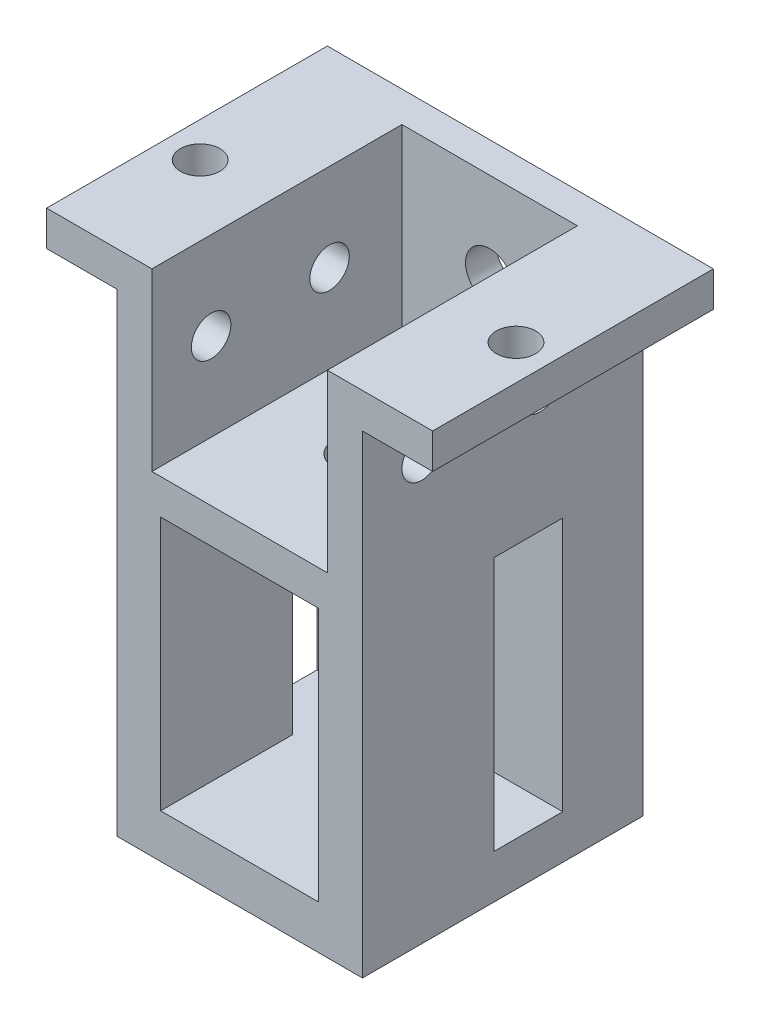
ISO-10303-21;
HEADER;
FILE_DESCRIPTION(('STEP AP214'),'2;1');
FILE_NAME('part.step','',(''),(''),'','','');
FILE_SCHEMA(('AUTOMOTIVE_DESIGN { 1 0 10303 214 1 1 1 1 }'));
ENDSEC;
DATA;
#1=APPLICATION_CONTEXT('core data for automotive mechanical design processes');
#2=APPLICATION_PROTOCOL_DEFINITION('international standard','automotive_design',2000,#1);
#3=PRODUCT_CONTEXT('',#1,'mechanical');
#4=PRODUCT('Part','Part','',(#3));
#5=PRODUCT_RELATED_PRODUCT_CATEGORY('part','',(#4));
#6=PRODUCT_DEFINITION_FORMATION('','',#4);
#7=PRODUCT_DEFINITION_CONTEXT('part definition',#1,'design');
#8=PRODUCT_DEFINITION('design','',#6,#7);
#9=PRODUCT_DEFINITION_SHAPE('','',#8);
#10=(LENGTH_UNIT() NAMED_UNIT(*) SI_UNIT(.MILLI.,.METRE.));
#11=(NAMED_UNIT(*) PLANE_ANGLE_UNIT() SI_UNIT($,.RADIAN.));
#12=(NAMED_UNIT(*) SI_UNIT($,.STERADIAN.) SOLID_ANGLE_UNIT());
#13=UNCERTAINTY_MEASURE_WITH_UNIT(LENGTH_MEASURE(1.E-05),#10,'distance_accuracy_value','');
#14=(GEOMETRIC_REPRESENTATION_CONTEXT(3) GLOBAL_UNCERTAINTY_ASSIGNED_CONTEXT((#13)) GLOBAL_UNIT_ASSIGNED_CONTEXT((#10,
#11,#12)) REPRESENTATION_CONTEXT('',''));
#15=CARTESIAN_POINT('',(0.,0.,0.));
#16=DIRECTION('',(0.,0.,1.));
#17=DIRECTION('',(1.,0.,0.));
#18=AXIS2_PLACEMENT_3D('',#15,#16,#17);
#19=CARTESIAN_POINT('',(-14.,0.,27.));
#20=DIRECTION('',(0.,1.,0.));
#21=DIRECTION('',(0.,0.,1.));
#22=AXIS2_PLACEMENT_3D('',#19,#20,#21);
#23=PLANE('',#22);
#24=CARTESIAN_POINT('',(0.,0.,13.5));
#25=DIRECTION('',(0.,1.,0.));
#26=DIRECTION('',(0.,0.,1.));
#27=AXIS2_PLACEMENT_3D('',#24,#25,#26);
#28=CIRCLE('',#27,2.75);
#29=CARTESIAN_POINT('',(0.,0.,10.75));
#30=VERTEX_POINT('',#29);
#31=EDGE_CURVE('E268',#30,#30,#28,.T.);
#32=ORIENTED_EDGE('',*,*,#31,.T.);
#33=EDGE_LOOP('',(#32));
#34=FACE_BOUND('',#33,.T.);
#35=DIRECTION('',(0.,0.,1.));
#36=VECTOR('',#35,1.);
#37=CARTESIAN_POINT('',(-9.,0.,27.));
#38=LINE('',#37,#36);
#39=CARTESIAN_POINT('',(-9.,0.,12.));
#40=VERTEX_POINT('',#39);
#41=CARTESIAN_POINT('',(-9.,0.,27.));
#42=VERTEX_POINT('',#41);
#43=EDGE_CURVE('E49',#40,#42,#38,.T.);
#44=ORIENTED_EDGE('',*,*,#43,.F.);
#45=DIRECTION('',(1.,0.,0.));
#46=VECTOR('',#45,1.);
#47=CARTESIAN_POINT('',(-14.,0.,12.));
#48=LINE('',#47,#46);
#49=CARTESIAN_POINT('',(-14.,0.,12.));
#50=VERTEX_POINT('',#49);
#51=EDGE_CURVE('E228',#50,#40,#48,.T.);
#52=ORIENTED_EDGE('',*,*,#51,.F.);
#53=DIRECTION('',(0.,0.,-1.));
#54=VECTOR('',#53,1.);
#55=CARTESIAN_POINT('',(-14.,0.,27.));
#56=LINE('',#55,#54);
#57=CARTESIAN_POINT('',(-14.,0.,4.17667107547479));
#58=VERTEX_POINT('',#57);
#59=EDGE_CURVE('E11',#50,#58,#56,.T.);
#60=ORIENTED_EDGE('',*,*,#59,.T.);
#61=DIRECTION('',(-1.,0.,0.));
#62=VECTOR('',#61,1.);
#63=CARTESIAN_POINT('',(-14.,0.,4.17667107547479));
#64=LINE('',#63,#62);
#65=CARTESIAN_POINT('',(14.,0.,4.17667107547479));
#66=VERTEX_POINT('',#65);
#67=EDGE_CURVE('E280',#66,#58,#64,.T.);
#68=ORIENTED_EDGE('',*,*,#67,.F.);
#69=DIRECTION('',(0.,0.,-1.));
#70=VECTOR('',#69,1.);
#71=CARTESIAN_POINT('',(14.,0.,27.));
#72=LINE('',#71,#70);
#73=CARTESIAN_POINT('',(14.,0.,12.));
#74=VERTEX_POINT('',#73);
#75=EDGE_CURVE('E41',#74,#66,#72,.T.);
#76=ORIENTED_EDGE('',*,*,#75,.F.);
#77=DIRECTION('',(1.,0.,0.));
#78=VECTOR('',#77,1.);
#79=CARTESIAN_POINT('',(14.,0.,12.));
#80=LINE('',#79,#78);
#81=CARTESIAN_POINT('',(9.,0.,12.));
#82=VERTEX_POINT('',#81);
#83=EDGE_CURVE('E245',#82,#74,#80,.T.);
#84=ORIENTED_EDGE('',*,*,#83,.F.);
#85=DIRECTION('',(0.,0.,-1.));
#86=VECTOR('',#85,1.);
#87=CARTESIAN_POINT('',(9.,0.,27.));
#88=LINE('',#87,#86);
#89=CARTESIAN_POINT('',(9.,0.,27.));
#90=VERTEX_POINT('',#89);
#91=EDGE_CURVE('E249',#90,#82,#88,.T.);
#92=ORIENTED_EDGE('',*,*,#91,.F.);
#93=DIRECTION('',(1.,0.,0.));
#94=VECTOR('',#93,1.);
#95=CARTESIAN_POINT('',(-14.,0.,27.));
#96=LINE('',#95,#94);
#97=EDGE_CURVE('E331',#42,#90,#96,.T.);
#98=ORIENTED_EDGE('',*,*,#97,.F.);
#99=EDGE_LOOP('',(#44,#52,#60,#68,#76,#84,#92,#98));
#100=FACE_BOUND('',#99,.T.);
#101=ADVANCED_FACE('F32',(#34,#100),#23,.F.);
#102=CARTESIAN_POINT('',(-14.,-29.,55.4429253066558));
#103=DIRECTION('',(0.,-1.,0.));
#104=DIRECTION('',(0.,0.,-1.));
#105=AXIS2_PLACEMENT_3D('',#102,#103,#104);
#106=PLANE('',#105);
#107=CARTESIAN_POINT('',(0.,-29.,13.5));
#108=DIRECTION('',(0.,-1.,0.));
#109=DIRECTION('',(0.,0.,-1.));
#110=AXIS2_PLACEMENT_3D('',#107,#108,#109);
#111=CIRCLE('',#110,2.75);
#112=CARTESIAN_POINT('',(0.,-29.,10.75));
#113=VERTEX_POINT('',#112);
#114=EDGE_CURVE('E264',#113,#113,#111,.T.);
#115=ORIENTED_EDGE('',*,*,#114,.T.);
#116=EDGE_LOOP('',(#115));
#117=FACE_BOUND('',#116,.T.);
#118=DIRECTION('',(0.,0.,1.));
#119=VECTOR('',#118,1.);
#120=CARTESIAN_POINT('',(-9.,-29.,27.));
#121=LINE('',#120,#119);
#122=CARTESIAN_POINT('',(-9.,-29.,12.));
#123=VERTEX_POINT('',#122);
#124=CARTESIAN_POINT('',(-9.,-29.,27.));
#125=VERTEX_POINT('',#124);
#126=EDGE_CURVE('E239',#123,#125,#121,.T.);
#127=ORIENTED_EDGE('',*,*,#126,.T.);
#128=DIRECTION('',(-1.,0.,0.));
#129=VECTOR('',#128,1.);
#130=CARTESIAN_POINT('',(-14.,-29.,27.));
#131=LINE('',#130,#129);
#132=CARTESIAN_POINT('',(9.,-29.,27.));
#133=VERTEX_POINT('',#132);
#134=EDGE_CURVE('E275',#133,#125,#131,.T.);
#135=ORIENTED_EDGE('',*,*,#134,.F.);
#136=DIRECTION('',(0.,0.,-1.));
#137=VECTOR('',#136,1.);
#138=CARTESIAN_POINT('',(9.,-29.,27.));
#139=LINE('',#138,#137);
#140=CARTESIAN_POINT('',(9.,-29.,12.));
#141=VERTEX_POINT('',#140);
#142=EDGE_CURVE('E255',#133,#141,#139,.T.);
#143=ORIENTED_EDGE('',*,*,#142,.T.);
#144=DIRECTION('',(1.,0.,0.));
#145=VECTOR('',#144,1.);
#146=CARTESIAN_POINT('',(14.,-29.,12.));
#147=LINE('',#146,#145);
#148=CARTESIAN_POINT('',(14.,-29.,12.));
#149=VERTEX_POINT('',#148);
#150=EDGE_CURVE('E242',#141,#149,#147,.T.);
#151=ORIENTED_EDGE('',*,*,#150,.T.);
#152=DIRECTION('',(0.,0.,-1.));
#153=VECTOR('',#152,1.);
#154=CARTESIAN_POINT('',(14.,-29.,55.4429253066558));
#155=LINE('',#154,#153);
#156=CARTESIAN_POINT('',(14.,-29.,4.17667107547479));
#157=VERTEX_POINT('',#156);
#158=EDGE_CURVE('E276',#149,#157,#155,.T.);
#159=ORIENTED_EDGE('',*,*,#158,.T.);
#160=DIRECTION('',(-1.,0.,0.));
#161=VECTOR('',#160,1.);
#162=CARTESIAN_POINT('',(-14.,-29.,4.17667107547479));
#163=LINE('',#162,#161);
#164=CARTESIAN_POINT('',(-14.,-29.,4.17667107547479));
#165=VERTEX_POINT('',#164);
#166=EDGE_CURVE('E272',#157,#165,#163,.T.);
#167=ORIENTED_EDGE('',*,*,#166,.T.);
#168=DIRECTION('',(0.,0.,-1.));
#169=VECTOR('',#168,1.);
#170=CARTESIAN_POINT('',(-14.,-29.,55.4429253066558));
#171=LINE('',#170,#169);
#172=CARTESIAN_POINT('',(-14.,-29.,12.));
#173=VERTEX_POINT('',#172);
#174=EDGE_CURVE('E271',#173,#165,#171,.T.);
#175=ORIENTED_EDGE('',*,*,#174,.F.);
#176=DIRECTION('',(1.,0.,0.));
#177=VECTOR('',#176,1.);
#178=CARTESIAN_POINT('',(-14.,-29.,12.));
#179=LINE('',#178,#177);
#180=EDGE_CURVE('E235',#173,#123,#179,.T.);
#181=ORIENTED_EDGE('',*,*,#180,.T.);
#182=EDGE_LOOP('',(#127,#135,#143,#151,#159,#167,#175,#181));
#183=FACE_BOUND('',#182,.T.);
#184=ADVANCED_FACE('F375',(#117,#183),#106,.F.);
#185=CARTESIAN_POINT('',(-14.,-34.,4.17667107547479));
#186=DIRECTION('',(0.,0.,-1.));
#187=DIRECTION('',(-1.,0.,0.));
#188=AXIS2_PLACEMENT_3D('',#185,#186,#187);
#189=PLANE('',#188);
#190=ORIENTED_EDGE('',*,*,#166,.F.);
#191=DIRECTION('',(0.,1.,0.));
#192=VECTOR('',#191,1.);
#193=CARTESIAN_POINT('',(14.,-34.,4.17667107547479));
#194=LINE('',#193,#192);
#195=EDGE_CURVE('E294',#157,#66,#194,.T.);
#196=ORIENTED_EDGE('',*,*,#195,.T.);
#197=ORIENTED_EDGE('',*,*,#67,.T.);
#198=DIRECTION('',(0.,1.,0.));
#199=VECTOR('',#198,1.);
#200=CARTESIAN_POINT('',(-14.,-34.,4.17667107547479));
#201=LINE('',#200,#199);
#202=EDGE_CURVE('E289',#165,#58,#201,.T.);
#203=ORIENTED_EDGE('',*,*,#202,.F.);
#204=EDGE_LOOP('',(#190,#196,#197,#203));
#205=FACE_BOUND('',#204,.T.);
#206=ADVANCED_FACE('F401',(#205),#189,.F.);
#207=CARTESIAN_POINT('',(-14.,20.,27.));
#208=DIRECTION('',(1.,0.,0.));
#209=DIRECTION('',(0.,1.,0.));
#210=AXIS2_PLACEMENT_3D('',#207,#208,#209);
#211=PLANE('',#210);
#212=DIRECTION('',(0.,1.,0.));
#213=VECTOR('',#212,1.);
#214=CARTESIAN_POINT('',(-14.,-34.002,12.));
#215=LINE('',#214,#213);
#216=EDGE_CURVE('E233',#173,#50,#215,.T.);
#217=ORIENTED_EDGE('',*,*,#216,.F.);
#218=ORIENTED_EDGE('',*,*,#174,.T.);
#219=ORIENTED_EDGE('',*,*,#202,.T.);
#220=ORIENTED_EDGE('',*,*,#59,.F.);
#221=EDGE_LOOP('',(#217,#218,#219,#220));
#222=FACE_BOUND('',#221,.T.);
#223=CARTESIAN_POINT('',(-14.,14.,6.75));
#224=DIRECTION('',(-1.,0.,0.));
#225=DIRECTION('',(0.,-1.,0.));
#226=AXIS2_PLACEMENT_3D('',#223,#224,#225);
#227=CIRCLE('',#226,2.25);
#228=CARTESIAN_POINT('',(-14.,11.75,6.75));
#229=VERTEX_POINT('',#228);
#230=EDGE_CURVE('E310',#229,#229,#227,.T.);
#231=ORIENTED_EDGE('',*,*,#230,.F.);
#232=EDGE_LOOP('',(#231));
#233=FACE_BOUND('',#232,.T.);
#234=CARTESIAN_POINT('',(-14.,14.,20.25));
#235=DIRECTION('',(-1.,0.,0.));
#236=DIRECTION('',(0.,-1.,0.));
#237=AXIS2_PLACEMENT_3D('',#234,#235,#236);
#238=CIRCLE('',#237,2.25);
#239=CARTESIAN_POINT('',(-14.,11.75,20.25));
#240=VERTEX_POINT('',#239);
#241=EDGE_CURVE('E301',#240,#240,#238,.T.);
#242=ORIENTED_EDGE('',*,*,#241,.F.);
#243=EDGE_LOOP('',(#242));
#244=FACE_BOUND('',#243,.T.);
#245=DIRECTION('',(0.,0.,-1.));
#246=VECTOR('',#245,1.);
#247=CARTESIAN_POINT('',(-14.,20.,27.));
#248=LINE('',#247,#246);
#249=CARTESIAN_POINT('',(-14.,20.,27.));
#250=VERTEX_POINT('',#249);
#251=CARTESIAN_POINT('',(-14.,20.,-5.));
#252=VERTEX_POINT('',#251);
#253=EDGE_CURVE('E352',#250,#252,#248,.T.);
#254=ORIENTED_EDGE('',*,*,#253,.T.);
#255=DIRECTION('',(0.,1.,0.));
#256=VECTOR('',#255,1.);
#257=CARTESIAN_POINT('',(-14.,-34.,-5.));
#258=LINE('',#257,#256);
#259=CARTESIAN_POINT('',(-14.,-34.,-5.));
#260=VERTEX_POINT('',#259);
#261=EDGE_CURVE('E210',#260,#252,#258,.T.);
#262=ORIENTED_EDGE('',*,*,#261,.F.);
#263=DIRECTION('',(0.,0.,-1.));
#264=VECTOR('',#263,1.);
#265=CARTESIAN_POINT('',(-14.,-34.,0.));
#266=LINE('',#265,#264);
#267=CARTESIAN_POINT('',(-14.,-34.,27.));
#268=VERTEX_POINT('',#267);
#269=EDGE_CURVE('E284',#268,#260,#266,.T.);
#270=ORIENTED_EDGE('',*,*,#269,.F.);
#271=DIRECTION('',(0.,-1.,0.));
#272=VECTOR('',#271,1.);
#273=CARTESIAN_POINT('',(-14.,20.,27.));
#274=LINE('',#273,#272);
#275=EDGE_CURVE('E329',#250,#268,#274,.T.);
#276=ORIENTED_EDGE('',*,*,#275,.F.);
#277=EDGE_LOOP('',(#254,#262,#270,#276));
#278=FACE_BOUND('',#277,.T.);
#279=ADVANCED_FACE('F34',(#222,#233,#244,#278),#211,.F.);
#280=CARTESIAN_POINT('',(14.,0.,27.));
#281=DIRECTION('',(-1.,0.,0.));
#282=DIRECTION('',(0.,-1.,0.));
#283=AXIS2_PLACEMENT_3D('',#280,#281,#282);
#284=PLANE('',#283);
#285=DIRECTION('',(0.,1.,0.));
#286=VECTOR('',#285,1.);
#287=CARTESIAN_POINT('',(14.,-34.002,12.));
#288=LINE('',#287,#286);
#289=EDGE_CURVE('E252',#149,#74,#288,.T.);
#290=ORIENTED_EDGE('',*,*,#289,.T.);
#291=ORIENTED_EDGE('',*,*,#75,.T.);
#292=ORIENTED_EDGE('',*,*,#195,.F.);
#293=ORIENTED_EDGE('',*,*,#158,.F.);
#294=EDGE_LOOP('',(#290,#291,#292,#293));
#295=FACE_BOUND('',#294,.T.);
#296=CARTESIAN_POINT('',(14.,14.,6.75));
#297=DIRECTION('',(-1.,0.,0.));
#298=DIRECTION('',(0.,-1.,0.));
#299=AXIS2_PLACEMENT_3D('',#296,#297,#298);
#300=CIRCLE('',#299,2.25);
#301=CARTESIAN_POINT('',(14.,11.75,6.75));
#302=VERTEX_POINT('',#301);
#303=EDGE_CURVE('E326',#302,#302,#300,.T.);
#304=ORIENTED_EDGE('',*,*,#303,.T.);
#305=EDGE_LOOP('',(#304));
#306=FACE_BOUND('',#305,.T.);
#307=CARTESIAN_POINT('',(14.,14.,20.25));
#308=DIRECTION('',(-1.,0.,0.));
#309=DIRECTION('',(0.,-1.,0.));
#310=AXIS2_PLACEMENT_3D('',#307,#308,#309);
#311=CIRCLE('',#310,2.25);
#312=CARTESIAN_POINT('',(14.,11.75,20.25));
#313=VERTEX_POINT('',#312);
#314=EDGE_CURVE('E319',#313,#313,#311,.T.);
#315=ORIENTED_EDGE('',*,*,#314,.T.);
#316=EDGE_LOOP('',(#315));
#317=FACE_BOUND('',#316,.T.);
#318=DIRECTION('',(0.,0.,1.));
#319=VECTOR('',#318,1.);
#320=CARTESIAN_POINT('',(14.,-34.,0.));
#321=LINE('',#320,#319);
#322=CARTESIAN_POINT('',(14.,-34.,-5.));
#323=VERTEX_POINT('',#322);
#324=CARTESIAN_POINT('',(14.,-34.,27.));
#325=VERTEX_POINT('',#324);
#326=EDGE_CURVE('E286',#323,#325,#321,.T.);
#327=ORIENTED_EDGE('',*,*,#326,.F.);
#328=DIRECTION('',(0.,-1.,0.));
#329=VECTOR('',#328,1.);
#330=CARTESIAN_POINT('',(14.,-34.,-5.));
#331=LINE('',#330,#329);
#332=CARTESIAN_POINT('',(14.,20.,-5.));
#333=VERTEX_POINT('',#332);
#334=EDGE_CURVE('E204',#333,#323,#331,.T.);
#335=ORIENTED_EDGE('',*,*,#334,.F.);
#336=DIRECTION('',(0.,0.,-1.));
#337=VECTOR('',#336,1.);
#338=CARTESIAN_POINT('',(14.,20.,27.));
#339=LINE('',#338,#337);
#340=CARTESIAN_POINT('',(14.,20.,27.));
#341=VERTEX_POINT('',#340);
#342=EDGE_CURVE('E366',#341,#333,#339,.T.);
#343=ORIENTED_EDGE('',*,*,#342,.F.);
#344=DIRECTION('',(0.,1.,0.));
#345=VECTOR('',#344,1.);
#346=CARTESIAN_POINT('',(14.,0.,27.));
#347=LINE('',#346,#345);
#348=EDGE_CURVE('E333',#325,#341,#347,.T.);
#349=ORIENTED_EDGE('',*,*,#348,.F.);
#350=EDGE_LOOP('',(#327,#335,#343,#349));
#351=FACE_BOUND('',#350,.T.);
#352=ADVANCED_FACE('F404',(#295,#306,#317,#351),#284,.F.);
#353=CARTESIAN_POINT('',(14.,20.,27.));
#354=DIRECTION('',(0.,1.,0.));
#355=DIRECTION('',(0.,0.,1.));
#356=AXIS2_PLACEMENT_3D('',#353,#354,#355);
#357=PLANE('',#356);
#358=CARTESIAN_POINT('',(18.,20.,13.5));
#359=DIRECTION('',(0.,-1.,0.));
#360=DIRECTION('',(0.,0.,-1.));
#361=AXIS2_PLACEMENT_3D('',#358,#359,#360);
#362=CIRCLE('',#361,2.25);
#363=CARTESIAN_POINT('',(18.,20.,11.25));
#364=VERTEX_POINT('',#363);
#365=EDGE_CURVE('E297',#364,#364,#362,.T.);
#366=ORIENTED_EDGE('',*,*,#365,.F.);
#367=EDGE_LOOP('',(#366));
#368=FACE_BOUND('',#367,.T.);
#369=ORIENTED_EDGE('',*,*,#342,.T.);
#370=DIRECTION('',(-1.,0.,0.));
#371=VECTOR('',#370,1.);
#372=CARTESIAN_POINT('',(14.,20.,-5.));
#373=LINE('',#372,#371);
#374=CARTESIAN_POINT('',(22.,20.,-5.));
#375=VERTEX_POINT('',#374);
#376=EDGE_CURVE('E225',#375,#333,#373,.T.);
#377=ORIENTED_EDGE('',*,*,#376,.F.);
#378=DIRECTION('',(0.,0.,-1.));
#379=VECTOR('',#378,1.);
#380=CARTESIAN_POINT('',(22.,20.,27.));
#381=LINE('',#380,#379);
#382=CARTESIAN_POINT('',(22.,20.,27.));
#383=VERTEX_POINT('',#382);
#384=EDGE_CURVE('E364',#383,#375,#381,.T.);
#385=ORIENTED_EDGE('',*,*,#384,.F.);
#386=DIRECTION('',(1.,0.,0.));
#387=VECTOR('',#386,1.);
#388=CARTESIAN_POINT('',(14.,20.,27.));
#389=LINE('',#388,#387);
#390=EDGE_CURVE('E335',#341,#383,#389,.T.);
#391=ORIENTED_EDGE('',*,*,#390,.F.);
#392=EDGE_LOOP('',(#369,#377,#385,#391));
#393=FACE_BOUND('',#392,.T.);
#394=ADVANCED_FACE('F407',(#368,#393),#357,.F.);
#395=CARTESIAN_POINT('',(22.,20.,27.));
#396=DIRECTION('',(-1.,0.,0.));
#397=DIRECTION('',(0.,0.,1.));
#398=AXIS2_PLACEMENT_3D('',#395,#396,#397);
#399=PLANE('',#398);
#400=ORIENTED_EDGE('',*,*,#384,.T.);
#401=DIRECTION('',(0.,-1.,0.));
#402=VECTOR('',#401,1.);
#403=CARTESIAN_POINT('',(22.,24.,-5.));
#404=LINE('',#403,#402);
#405=CARTESIAN_POINT('',(22.,24.,-5.));
#406=VERTEX_POINT('',#405);
#407=EDGE_CURVE('E222',#406,#375,#404,.T.);
#408=ORIENTED_EDGE('',*,*,#407,.F.);
#409=DIRECTION('',(0.,0.,-1.));
#410=VECTOR('',#409,1.);
#411=CARTESIAN_POINT('',(22.,24.,27.));
#412=LINE('',#411,#410);
#413=CARTESIAN_POINT('',(22.,24.,27.));
#414=VERTEX_POINT('',#413);
#415=EDGE_CURVE('E362',#414,#406,#412,.T.);
#416=ORIENTED_EDGE('',*,*,#415,.F.);
#417=DIRECTION('',(0.,1.,0.));
#418=VECTOR('',#417,1.);
#419=CARTESIAN_POINT('',(22.,20.,27.));
#420=LINE('',#419,#418);
#421=EDGE_CURVE('E337',#383,#414,#420,.T.);
#422=ORIENTED_EDGE('',*,*,#421,.F.);
#423=EDGE_LOOP('',(#400,#408,#416,#422));
#424=FACE_BOUND('',#423,.T.);
#425=ADVANCED_FACE('F411',(#424),#399,.F.);
#426=CARTESIAN_POINT('',(10.,24.,27.));
#427=DIRECTION('',(1.,0.,0.));
#428=DIRECTION('',(0.,1.,0.));
#429=AXIS2_PLACEMENT_3D('',#426,#427,#428);
#430=PLANE('',#429);
#431=CARTESIAN_POINT('',(10.,14.,6.75));
#432=DIRECTION('',(1.,0.,0.));
#433=DIRECTION('',(0.,1.,0.));
#434=AXIS2_PLACEMENT_3D('',#431,#432,#433);
#435=CIRCLE('',#434,2.25);
#436=CARTESIAN_POINT('',(10.,16.25,6.75));
#437=VERTEX_POINT('',#436);
#438=EDGE_CURVE('E323',#437,#437,#435,.T.);
#439=ORIENTED_EDGE('',*,*,#438,.T.);
#440=EDGE_LOOP('',(#439));
#441=FACE_BOUND('',#440,.T.);
#442=CARTESIAN_POINT('',(10.,14.,20.25));
#443=DIRECTION('',(1.,0.,0.));
#444=DIRECTION('',(0.,1.,0.));
#445=AXIS2_PLACEMENT_3D('',#442,#443,#444);
#446=CIRCLE('',#445,2.25);
#447=CARTESIAN_POINT('',(10.,16.25,20.25));
#448=VERTEX_POINT('',#447);
#449=EDGE_CURVE('E316',#448,#448,#446,.T.);
#450=ORIENTED_EDGE('',*,*,#449,.T.);
#451=EDGE_LOOP('',(#450));
#452=FACE_BOUND('',#451,.T.);
#453=DIRECTION('',(0.,0.,-1.));
#454=VECTOR('',#453,1.);
#455=CARTESIAN_POINT('',(10.,24.,27.));
#456=LINE('',#455,#454);
#457=CARTESIAN_POINT('',(10.,24.,27.));
#458=VERTEX_POINT('',#457);
#459=CARTESIAN_POINT('',(10.,24.,-1.5));
#460=VERTEX_POINT('',#459);
#461=EDGE_CURVE('E360',#458,#460,#456,.T.);
#462=ORIENTED_EDGE('',*,*,#461,.T.);
#463=DIRECTION('',(0.,1.,0.));
#464=VECTOR('',#463,1.);
#465=CARTESIAN_POINT('',(10.,4.,-1.5));
#466=LINE('',#465,#464);
#467=CARTESIAN_POINT('',(10.,4.,-1.5));
#468=VERTEX_POINT('',#467);
#469=EDGE_CURVE('E192',#468,#460,#466,.T.);
#470=ORIENTED_EDGE('',*,*,#469,.F.);
#471=DIRECTION('',(0.,0.,-1.));
#472=VECTOR('',#471,1.);
#473=CARTESIAN_POINT('',(10.,4.,27.));
#474=LINE('',#473,#472);
#475=CARTESIAN_POINT('',(10.,4.,27.));
#476=VERTEX_POINT('',#475);
#477=EDGE_CURVE('E182',#476,#468,#474,.T.);
#478=ORIENTED_EDGE('',*,*,#477,.F.);
#479=DIRECTION('',(0.,-1.,0.));
#480=VECTOR('',#479,1.);
#481=CARTESIAN_POINT('',(10.,24.,27.));
#482=LINE('',#481,#480);
#483=EDGE_CURVE('E341',#458,#476,#482,.T.);
#484=ORIENTED_EDGE('',*,*,#483,.F.);
#485=EDGE_LOOP('',(#462,#470,#478,#484));
#486=FACE_BOUND('',#485,.T.);
#487=ADVANCED_FACE('F415',(#441,#452,#486),#430,.F.);
#488=CARTESIAN_POINT('',(10.,4.,27.));
#489=DIRECTION('',(0.,-1.,0.));
#490=DIRECTION('',(1.,0.,0.));
#491=AXIS2_PLACEMENT_3D('',#488,#489,#490);
#492=PLANE('',#491);
#493=CARTESIAN_POINT('',(0.,4.,13.5));
#494=DIRECTION('',(0.,-1.,0.));
#495=DIRECTION('',(1.,0.,0.));
#496=AXIS2_PLACEMENT_3D('',#493,#494,#495);
#497=CIRCLE('',#496,2.75);
#498=CARTESIAN_POINT('',(0.,4.,10.75));
#499=VERTEX_POINT('',#498);
#500=EDGE_CURVE('E265',#499,#499,#497,.T.);
#501=ORIENTED_EDGE('',*,*,#500,.T.);
#502=EDGE_LOOP('',(#501));
#503=FACE_BOUND('',#502,.T.);
#504=ORIENTED_EDGE('',*,*,#477,.T.);
#505=DIRECTION('',(1.,0.,0.));
#506=VECTOR('',#505,1.);
#507=CARTESIAN_POINT('',(-10.,4.,-1.5));
#508=LINE('',#507,#506);
#509=CARTESIAN_POINT('',(-10.,4.,-1.5));
#510=VERTEX_POINT('',#509);
#511=EDGE_CURVE('E186',#510,#468,#508,.T.);
#512=ORIENTED_EDGE('',*,*,#511,.F.);
#513=DIRECTION('',(0.,0.,-1.));
#514=VECTOR('',#513,1.);
#515=CARTESIAN_POINT('',(-10.,4.,27.));
#516=LINE('',#515,#514);
#517=CARTESIAN_POINT('',(-10.,4.,27.));
#518=VERTEX_POINT('',#517);
#519=EDGE_CURVE('E172',#518,#510,#516,.T.);
#520=ORIENTED_EDGE('',*,*,#519,.F.);
#521=DIRECTION('',(-1.,0.,0.));
#522=VECTOR('',#521,1.);
#523=CARTESIAN_POINT('',(10.,4.,27.));
#524=LINE('',#523,#522);
#525=EDGE_CURVE('E343',#476,#518,#524,.T.);
#526=ORIENTED_EDGE('',*,*,#525,.F.);
#527=EDGE_LOOP('',(#504,#512,#520,#526));
#528=FACE_BOUND('',#527,.T.);
#529=ADVANCED_FACE('F187',(#503,#528),#492,.F.);
#530=CARTESIAN_POINT('',(-10.,4.,27.));
#531=DIRECTION('',(-1.,0.,0.));
#532=DIRECTION('',(0.,0.,1.));
#533=AXIS2_PLACEMENT_3D('',#530,#531,#532);
#534=PLANE('',#533);
#535=CARTESIAN_POINT('',(-10.,14.,6.75));
#536=DIRECTION('',(-1.,0.,0.));
#537=DIRECTION('',(0.,0.,1.));
#538=AXIS2_PLACEMENT_3D('',#535,#536,#537);
#539=CIRCLE('',#538,2.25);
#540=CARTESIAN_POINT('',(-10.,14.,9.));
#541=VERTEX_POINT('',#540);
#542=EDGE_CURVE('E322',#541,#541,#539,.T.);
#543=ORIENTED_EDGE('',*,*,#542,.T.);
#544=EDGE_LOOP('',(#543));
#545=FACE_BOUND('',#544,.T.);
#546=CARTESIAN_POINT('',(-10.,14.,20.25));
#547=DIRECTION('',(-1.,0.,0.));
#548=DIRECTION('',(0.,0.,1.));
#549=AXIS2_PLACEMENT_3D('',#546,#547,#548);
#550=CIRCLE('',#549,2.25);
#551=CARTESIAN_POINT('',(-10.,14.,22.5));
#552=VERTEX_POINT('',#551);
#553=EDGE_CURVE('E313',#552,#552,#550,.T.);
#554=ORIENTED_EDGE('',*,*,#553,.T.);
#555=EDGE_LOOP('',(#554));
#556=FACE_BOUND('',#555,.T.);
#557=ORIENTED_EDGE('',*,*,#519,.T.);
#558=DIRECTION('',(0.,-1.,0.));
#559=VECTOR('',#558,1.);
#560=CARTESIAN_POINT('',(-10.,4.,-1.5));
#561=LINE('',#560,#559);
#562=CARTESIAN_POINT('',(-10.,24.,-1.5));
#563=VERTEX_POINT('',#562);
#564=EDGE_CURVE('E177',#563,#510,#561,.T.);
#565=ORIENTED_EDGE('',*,*,#564,.F.);
#566=DIRECTION('',(0.,0.,-1.));
#567=VECTOR('',#566,1.);
#568=CARTESIAN_POINT('',(-10.,24.,27.));
#569=LINE('',#568,#567);
#570=CARTESIAN_POINT('',(-10.,24.,27.));
#571=VERTEX_POINT('',#570);
#572=EDGE_CURVE('E183',#571,#563,#569,.T.);
#573=ORIENTED_EDGE('',*,*,#572,.F.);
#574=DIRECTION('',(0.,1.,0.));
#575=VECTOR('',#574,1.);
#576=CARTESIAN_POINT('',(-10.,4.,27.));
#577=LINE('',#576,#575);
#578=EDGE_CURVE('E179',#518,#571,#577,.T.);
#579=ORIENTED_EDGE('',*,*,#578,.F.);
#580=EDGE_LOOP('',(#557,#565,#573,#579));
#581=FACE_BOUND('',#580,.T.);
#582=ADVANCED_FACE('F174',(#545,#556,#581),#534,.F.);
#583=CARTESIAN_POINT('',(-10.,24.,27.));
#584=DIRECTION('',(0.,-1.,0.));
#585=DIRECTION('',(0.,0.,-1.));
#586=AXIS2_PLACEMENT_3D('',#583,#584,#585);
#587=PLANE('',#586);
#588=ORIENTED_EDGE('',*,*,#572,.T.);
#589=DIRECTION('',(-1.,0.,0.));
#590=VECTOR('',#589,1.);
#591=CARTESIAN_POINT('',(-10.,24.,-1.5));
#592=LINE('',#591,#590);
#593=EDGE_CURVE('E196',#460,#563,#592,.T.);
#594=ORIENTED_EDGE('',*,*,#593,.F.);
#595=ORIENTED_EDGE('',*,*,#461,.F.);
#596=DIRECTION('',(-1.,0.,0.));
#597=VECTOR('',#596,1.);
#598=CARTESIAN_POINT('',(22.,24.,27.));
#599=LINE('',#598,#597);
#600=EDGE_CURVE('E339',#414,#458,#599,.T.);
#601=ORIENTED_EDGE('',*,*,#600,.F.);
#602=ORIENTED_EDGE('',*,*,#415,.T.);
#603=DIRECTION('',(1.,0.,0.));
#604=VECTOR('',#603,1.);
#605=CARTESIAN_POINT('',(-22.,24.,-5.));
#606=LINE('',#605,#604);
#607=CARTESIAN_POINT('',(-22.,24.,-5.));
#608=VERTEX_POINT('',#607);
#609=EDGE_CURVE('E219',#608,#406,#606,.T.);
#610=ORIENTED_EDGE('',*,*,#609,.F.);
#611=DIRECTION('',(0.,0.,-1.));
#612=VECTOR('',#611,1.);
#613=CARTESIAN_POINT('',(-22.,24.,27.));
#614=LINE('',#613,#612);
#615=CARTESIAN_POINT('',(-22.,24.,27.));
#616=VERTEX_POINT('',#615);
#617=EDGE_CURVE('E356',#616,#608,#614,.T.);
#618=ORIENTED_EDGE('',*,*,#617,.F.);
#619=DIRECTION('',(-1.,0.,0.));
#620=VECTOR('',#619,1.);
#621=CARTESIAN_POINT('',(-10.,24.,27.));
#622=LINE('',#621,#620);
#623=EDGE_CURVE('E346',#571,#616,#622,.T.);
#624=ORIENTED_EDGE('',*,*,#623,.F.);
#625=EDGE_LOOP('',(#588,#594,#595,#601,#602,#610,#618,#624));
#626=FACE_BOUND('',#625,.T.);
#627=CARTESIAN_POINT('',(-18.,24.,13.5));
#628=DIRECTION('',(0.,-1.,0.));
#629=DIRECTION('',(0.,0.,-1.));
#630=AXIS2_PLACEMENT_3D('',#627,#628,#629);
#631=CIRCLE('',#630,2.25);
#632=CARTESIAN_POINT('',(-18.,24.,11.25));
#633=VERTEX_POINT('',#632);
#634=EDGE_CURVE('E298',#633,#633,#631,.T.);
#635=ORIENTED_EDGE('',*,*,#634,.T.);
#636=EDGE_LOOP('',(#635));
#637=FACE_BOUND('',#636,.T.);
#638=CARTESIAN_POINT('',(18.,24.,13.5));
#639=DIRECTION('',(0.,-1.,0.));
#640=DIRECTION('',(0.,0.,-1.));
#641=AXIS2_PLACEMENT_3D('',#638,#639,#640);
#642=CIRCLE('',#641,2.25);
#643=CARTESIAN_POINT('',(18.,24.,11.25));
#644=VERTEX_POINT('',#643);
#645=EDGE_CURVE('E305',#644,#644,#642,.T.);
#646=ORIENTED_EDGE('',*,*,#645,.T.);
#647=EDGE_LOOP('',(#646));
#648=FACE_BOUND('',#647,.T.);
#649=ADVANCED_FACE('F425',(#626,#637,#648),#587,.F.);
#650=CARTESIAN_POINT('',(-22.,24.,27.));
#651=DIRECTION('',(1.,0.,0.));
#652=DIRECTION('',(0.,0.,-1.));
#653=AXIS2_PLACEMENT_3D('',#650,#651,#652);
#654=PLANE('',#653);
#655=ORIENTED_EDGE('',*,*,#617,.T.);
#656=DIRECTION('',(0.,1.,0.));
#657=VECTOR('',#656,1.);
#658=CARTESIAN_POINT('',(-22.,24.,-5.));
#659=LINE('',#658,#657);
#660=CARTESIAN_POINT('',(-22.,20.,-5.));
#661=VERTEX_POINT('',#660);
#662=EDGE_CURVE('E216',#661,#608,#659,.T.);
#663=ORIENTED_EDGE('',*,*,#662,.F.);
#664=DIRECTION('',(0.,0.,-1.));
#665=VECTOR('',#664,1.);
#666=CARTESIAN_POINT('',(-22.,20.,27.));
#667=LINE('',#666,#665);
#668=CARTESIAN_POINT('',(-22.,20.,27.));
#669=VERTEX_POINT('',#668);
#670=EDGE_CURVE('E354',#669,#661,#667,.T.);
#671=ORIENTED_EDGE('',*,*,#670,.F.);
#672=DIRECTION('',(0.,-1.,0.));
#673=VECTOR('',#672,1.);
#674=CARTESIAN_POINT('',(-22.,24.,27.));
#675=LINE('',#674,#673);
#676=EDGE_CURVE('E348',#616,#669,#675,.T.);
#677=ORIENTED_EDGE('',*,*,#676,.F.);
#678=EDGE_LOOP('',(#655,#663,#671,#677));
#679=FACE_BOUND('',#678,.T.);
#680=ADVANCED_FACE('F429',(#679),#654,.F.);
#681=CARTESIAN_POINT('',(-22.,20.,27.));
#682=DIRECTION('',(0.,1.,0.));
#683=DIRECTION('',(0.,0.,1.));
#684=AXIS2_PLACEMENT_3D('',#681,#682,#683);
#685=PLANE('',#684);
#686=CARTESIAN_POINT('',(-18.,20.,13.5));
#687=DIRECTION('',(0.,-1.,0.));
#688=DIRECTION('',(0.,0.,-1.));
#689=AXIS2_PLACEMENT_3D('',#686,#687,#688);
#690=CIRCLE('',#689,2.25);
#691=CARTESIAN_POINT('',(-18.,20.,11.25));
#692=VERTEX_POINT('',#691);
#693=EDGE_CURVE('E302',#692,#692,#690,.T.);
#694=ORIENTED_EDGE('',*,*,#693,.F.);
#695=EDGE_LOOP('',(#694));
#696=FACE_BOUND('',#695,.T.);
#697=ORIENTED_EDGE('',*,*,#670,.T.);
#698=DIRECTION('',(-1.,0.,0.));
#699=VECTOR('',#698,1.);
#700=CARTESIAN_POINT('',(-14.,20.,-5.));
#701=LINE('',#700,#699);
#702=EDGE_CURVE('E213',#252,#661,#701,.T.);
#703=ORIENTED_EDGE('',*,*,#702,.F.);
#704=ORIENTED_EDGE('',*,*,#253,.F.);
#705=DIRECTION('',(1.,0.,0.));
#706=VECTOR('',#705,1.);
#707=CARTESIAN_POINT('',(-22.,20.,27.));
#708=LINE('',#707,#706);
#709=EDGE_CURVE('E350',#669,#250,#708,.T.);
#710=ORIENTED_EDGE('',*,*,#709,.F.);
#711=EDGE_LOOP('',(#697,#703,#704,#710));
#712=FACE_BOUND('',#711,.T.);
#713=ADVANCED_FACE('F433',(#696,#712),#685,.F.);
#714=CARTESIAN_POINT('',(0.,0.,27.));
#715=DIRECTION('',(0.,0.,1.));
#716=DIRECTION('',(1.,0.,0.));
#717=AXIS2_PLACEMENT_3D('',#714,#715,#716);
#718=PLANE('',#717);
#719=ORIENTED_EDGE('',*,*,#275,.T.);
#720=DIRECTION('',(1.,0.,0.));
#721=VECTOR('',#720,1.);
#722=CARTESIAN_POINT('',(-14.,-34.,27.));
#723=LINE('',#722,#721);
#724=EDGE_CURVE('E277',#268,#325,#723,.T.);
#725=ORIENTED_EDGE('',*,*,#724,.T.);
#726=ORIENTED_EDGE('',*,*,#348,.T.);
#727=ORIENTED_EDGE('',*,*,#390,.T.);
#728=ORIENTED_EDGE('',*,*,#421,.T.);
#729=ORIENTED_EDGE('',*,*,#600,.T.);
#730=ORIENTED_EDGE('',*,*,#483,.T.);
#731=ORIENTED_EDGE('',*,*,#525,.T.);
#732=ORIENTED_EDGE('',*,*,#578,.T.);
#733=ORIENTED_EDGE('',*,*,#623,.T.);
#734=ORIENTED_EDGE('',*,*,#676,.T.);
#735=ORIENTED_EDGE('',*,*,#709,.T.);
#736=EDGE_LOOP('',(#719,#725,#726,#727,#728,#729,#730,#731,#732,#733,#734,#735));
#737=FACE_BOUND('',#736,.T.);
#738=ORIENTED_EDGE('',*,*,#134,.T.);
#739=DIRECTION('',(0.,1.,0.));
#740=VECTOR('',#739,1.);
#741=CARTESIAN_POINT('',(-9.,-34.002,27.));
#742=LINE('',#741,#740);
#743=EDGE_CURVE('E232',#125,#42,#742,.T.);
#744=ORIENTED_EDGE('',*,*,#743,.T.);
#745=ORIENTED_EDGE('',*,*,#97,.T.);
#746=DIRECTION('',(0.,1.,0.));
#747=VECTOR('',#746,1.);
#748=CARTESIAN_POINT('',(9.,-34.002,27.));
#749=LINE('',#748,#747);
#750=EDGE_CURVE('E57',#133,#90,#749,.T.);
#751=ORIENTED_EDGE('',*,*,#750,.F.);
#752=EDGE_LOOP('',(#738,#744,#745,#751));
#753=FACE_BOUND('',#752,.T.);
#754=ADVANCED_FACE('F437',(#737,#753),#718,.T.);
#755=CARTESIAN_POINT('',(22.,14.,20.25));
#756=DIRECTION('',(-1.,0.,0.));
#757=DIRECTION('',(0.,-1.,0.));
#758=AXIS2_PLACEMENT_3D('',#755,#756,#757);
#759=CYLINDRICAL_SURFACE('',#758,2.25);
#760=ORIENTED_EDGE('',*,*,#241,.T.);
#761=EDGE_LOOP('',(#760));
#762=FACE_BOUND('',#761,.T.);
#763=ORIENTED_EDGE('',*,*,#553,.F.);
#764=EDGE_LOOP('',(#763));
#765=FACE_BOUND('',#764,.T.);
#766=ADVANCED_FACE('F441',(#762,#765),#759,.F.);
#767=CARTESIAN_POINT('',(22.,14.,6.75));
#768=DIRECTION('',(-1.,0.,0.));
#769=DIRECTION('',(0.,-1.,0.));
#770=AXIS2_PLACEMENT_3D('',#767,#768,#769);
#771=CYLINDRICAL_SURFACE('',#770,2.25);
#772=ORIENTED_EDGE('',*,*,#230,.T.);
#773=EDGE_LOOP('',(#772));
#774=FACE_BOUND('',#773,.T.);
#775=ORIENTED_EDGE('',*,*,#542,.F.);
#776=EDGE_LOOP('',(#775));
#777=FACE_BOUND('',#776,.T.);
#778=ADVANCED_FACE('F447',(#774,#777),#771,.F.);
#779=ORIENTED_EDGE('',*,*,#449,.F.);
#780=EDGE_LOOP('',(#779));
#781=FACE_BOUND('',#780,.T.);
#782=ORIENTED_EDGE('',*,*,#314,.F.);
#783=EDGE_LOOP('',(#782));
#784=FACE_BOUND('',#783,.T.);
#785=ADVANCED_FACE('F443',(#781,#784),#759,.F.);
#786=ORIENTED_EDGE('',*,*,#438,.F.);
#787=EDGE_LOOP('',(#786));
#788=FACE_BOUND('',#787,.T.);
#789=ORIENTED_EDGE('',*,*,#303,.F.);
#790=EDGE_LOOP('',(#789));
#791=FACE_BOUND('',#790,.T.);
#792=ADVANCED_FACE('F446',(#788,#791),#771,.F.);
#793=CARTESIAN_POINT('',(-18.,24.,13.5));
#794=DIRECTION('',(0.,-1.,0.));
#795=DIRECTION('',(0.,0.,-1.));
#796=AXIS2_PLACEMENT_3D('',#793,#794,#795);
#797=CYLINDRICAL_SURFACE('',#796,2.25);
#798=ORIENTED_EDGE('',*,*,#634,.F.);
#799=EDGE_LOOP('',(#798));
#800=FACE_BOUND('',#799,.T.);
#801=ORIENTED_EDGE('',*,*,#693,.T.);
#802=EDGE_LOOP('',(#801));
#803=FACE_BOUND('',#802,.T.);
#804=ADVANCED_FACE('F451',(#800,#803),#797,.F.);
#805=CARTESIAN_POINT('',(18.,24.,13.5));
#806=DIRECTION('',(0.,-1.,0.));
#807=DIRECTION('',(0.,0.,-1.));
#808=AXIS2_PLACEMENT_3D('',#805,#806,#807);
#809=CYLINDRICAL_SURFACE('',#808,2.25);
#810=ORIENTED_EDGE('',*,*,#645,.F.);
#811=EDGE_LOOP('',(#810));
#812=FACE_BOUND('',#811,.T.);
#813=ORIENTED_EDGE('',*,*,#365,.T.);
#814=EDGE_LOOP('',(#813));
#815=FACE_BOUND('',#814,.T.);
#816=ADVANCED_FACE('F391',(#812,#815),#809,.F.);
#817=CARTESIAN_POINT('',(0.,-34.,0.));
#818=DIRECTION('',(0.,1.,0.));
#819=DIRECTION('',(0.,0.,1.));
#820=AXIS2_PLACEMENT_3D('',#817,#818,#819);
#821=PLANE('',#820);
#822=CARTESIAN_POINT('',(0.,-34.,13.5));
#823=DIRECTION('',(0.,-1.,0.));
#824=DIRECTION('',(0.,0.,-1.));
#825=AXIS2_PLACEMENT_3D('',#822,#823,#824);
#826=CIRCLE('',#825,2.75);
#827=CARTESIAN_POINT('',(0.,-34.,10.75));
#828=VERTEX_POINT('',#827);
#829=EDGE_CURVE('E248',#828,#828,#826,.T.);
#830=ORIENTED_EDGE('',*,*,#829,.F.);
#831=EDGE_LOOP('',(#830));
#832=FACE_BOUND('',#831,.T.);
#833=ORIENTED_EDGE('',*,*,#269,.T.);
#834=DIRECTION('',(-1.,0.,0.));
#835=VECTOR('',#834,1.);
#836=CARTESIAN_POINT('',(14.,-34.,-5.));
#837=LINE('',#836,#835);
#838=EDGE_CURVE('E207',#323,#260,#837,.T.);
#839=ORIENTED_EDGE('',*,*,#838,.F.);
#840=ORIENTED_EDGE('',*,*,#326,.T.);
#841=ORIENTED_EDGE('',*,*,#724,.F.);
#842=EDGE_LOOP('',(#833,#839,#840,#841));
#843=FACE_BOUND('',#842,.T.);
#844=ADVANCED_FACE('F381',(#832,#843),#821,.F.);
#845=CARTESIAN_POINT('',(0.,24.,13.5));
#846=DIRECTION('',(0.,-1.,0.));
#847=DIRECTION('',(0.,0.,-1.));
#848=AXIS2_PLACEMENT_3D('',#845,#846,#847);
#849=CYLINDRICAL_SURFACE('',#848,2.75);
#850=CARTESIAN_POINT('',(0.,-34.,10.75));
#851=CARTESIAN_POINT('',(0.,-33.9479166666667,10.75));
#852=CARTESIAN_POINT('',(0.,-33.8958333333333,10.75));
#853=CARTESIAN_POINT('',(0.,-33.7916666666667,10.75));
#854=CARTESIAN_POINT('',(0.,-33.7395833333333,10.75));
#855=CARTESIAN_POINT('',(0.,-33.6354166666667,10.75));
#856=CARTESIAN_POINT('',(0.,-33.5833333333333,10.75));
#857=CARTESIAN_POINT('',(0.,-33.4791666666667,10.75));
#858=CARTESIAN_POINT('',(0.,-33.4270833333333,10.75));
#859=CARTESIAN_POINT('',(0.,-33.3229166666667,10.75));
#860=CARTESIAN_POINT('',(0.,-33.2708333333333,10.75));
#861=CARTESIAN_POINT('',(0.,-33.1666666666667,10.75));
#862=CARTESIAN_POINT('',(0.,-33.1145833333333,10.75));
#863=CARTESIAN_POINT('',(0.,-33.0104166666667,10.75));
#864=CARTESIAN_POINT('',(0.,-32.9583333333333,10.75));
#865=CARTESIAN_POINT('',(0.,-32.8541666666667,10.75));
#866=CARTESIAN_POINT('',(0.,-32.8020833333333,10.75));
#867=CARTESIAN_POINT('',(0.,-32.6979166666667,10.75));
#868=CARTESIAN_POINT('',(0.,-32.6458333333333,10.75));
#869=CARTESIAN_POINT('',(0.,-32.5416666666667,10.75));
#870=CARTESIAN_POINT('',(0.,-32.4895833333333,10.75));
#871=CARTESIAN_POINT('',(0.,-32.3854166666667,10.75));
#872=CARTESIAN_POINT('',(0.,-32.3333333333333,10.75));
#873=CARTESIAN_POINT('',(0.,-32.2291666666667,10.75));
#874=CARTESIAN_POINT('',(0.,-32.1770833333333,10.75));
#875=CARTESIAN_POINT('',(0.,-32.0729166666667,10.75));
#876=CARTESIAN_POINT('',(0.,-32.0208333333333,10.75));
#877=CARTESIAN_POINT('',(0.,-31.9166666666667,10.75));
#878=CARTESIAN_POINT('',(0.,-31.8645833333333,10.75));
#879=CARTESIAN_POINT('',(0.,-31.7604166666667,10.75));
#880=CARTESIAN_POINT('',(0.,-31.7083333333333,10.75));
#881=CARTESIAN_POINT('',(0.,-31.6041666666667,10.75));
#882=CARTESIAN_POINT('',(0.,-31.5520833333333,10.75));
#883=CARTESIAN_POINT('',(0.,-31.4479166666667,10.75));
#884=CARTESIAN_POINT('',(0.,-31.3958333333333,10.75));
#885=CARTESIAN_POINT('',(0.,-31.2916666666667,10.75));
#886=CARTESIAN_POINT('',(0.,-31.2395833333333,10.75));
#887=CARTESIAN_POINT('',(0.,-31.1354166666667,10.75));
#888=CARTESIAN_POINT('',(0.,-31.0833333333333,10.75));
#889=CARTESIAN_POINT('',(0.,-30.9791666666667,10.75));
#890=CARTESIAN_POINT('',(0.,-30.9270833333333,10.75));
#891=CARTESIAN_POINT('',(0.,-30.8229166666667,10.75));
#892=CARTESIAN_POINT('',(0.,-30.7708333333333,10.75));
#893=CARTESIAN_POINT('',(0.,-30.6666666666667,10.75));
#894=CARTESIAN_POINT('',(0.,-30.6145833333333,10.75));
#895=CARTESIAN_POINT('',(0.,-30.5104166666667,10.75));
#896=CARTESIAN_POINT('',(0.,-30.4583333333333,10.75));
#897=CARTESIAN_POINT('',(0.,-30.3541666666667,10.75));
#898=CARTESIAN_POINT('',(0.,-30.3020833333333,10.75));
#899=CARTESIAN_POINT('',(0.,-30.1979166666667,10.75));
#900=CARTESIAN_POINT('',(0.,-30.1458333333333,10.75));
#901=CARTESIAN_POINT('',(0.,-30.0416666666667,10.75));
#902=CARTESIAN_POINT('',(0.,-29.9895833333333,10.75));
#903=CARTESIAN_POINT('',(0.,-29.8854166666667,10.75));
#904=CARTESIAN_POINT('',(0.,-29.8333333333333,10.75));
#905=CARTESIAN_POINT('',(0.,-29.7291666666667,10.75));
#906=CARTESIAN_POINT('',(0.,-29.6770833333333,10.75));
#907=CARTESIAN_POINT('',(0.,-29.5729166666667,10.75));
#908=CARTESIAN_POINT('',(0.,-29.5208333333333,10.75));
#909=CARTESIAN_POINT('',(0.,-29.4166666666667,10.75));
#910=CARTESIAN_POINT('',(0.,-29.3645833333333,10.75));
#911=CARTESIAN_POINT('',(0.,-29.2604166666667,10.75));
#912=CARTESIAN_POINT('',(0.,-29.2083333333333,10.75));
#913=CARTESIAN_POINT('',(0.,-29.1041666666667,10.75));
#914=CARTESIAN_POINT('',(0.,-29.0520833333333,10.75));
#915=CARTESIAN_POINT('',(0.,-29.,10.75));
#916=B_SPLINE_CURVE_WITH_KNOTS('',3,(#850,#851,#852,#853,#854,#855,#856,#857,#858,#859,#860,
#861,#862,#863,#864,#865,#866,#867,#868,#869,#870,#871,#872,#873,#874,#875,#876,#877,#878,#879,
#880,#881,#882,#883,#884,#885,#886,#887,#888,#889,#890,#891,#892,#893,#894,#895,#896,#897,#898,
#899,#900,#901,#902,#903,#904,#905,#906,#907,#908,#909,#910,#911,#912,#913,#914,#915),
.UNSPECIFIED.,.F.,.F.,(4,2,2,2,2,2,2,2,2,2,2,2,2,2,2,2,2,2,2,2,2,2,2,2,2,2,2,2,2,2,2,2,4),(0.,
0.156249999999997,0.3125,0.468750000000004,0.625000000000001,0.781249999999997,
0.937500000000001,1.09375,1.25,1.40625,1.5625,1.71875,1.875,2.03125,2.1875,2.34375000000001,2.5,
2.65625,2.8125,2.96875000000001,3.125,3.28125,3.4375,3.59375000000001,3.75,3.90625,4.0625,
4.21875000000001,4.375,4.53125,4.6875,4.84375000000001,5.),.UNSPECIFIED.);
#917=EDGE_CURVE('BSEAM378',#828,#113,#916,.T.);
#918=ORIENTED_EDGE('',*,*,#829,.T.);
#919=ORIENTED_EDGE('',*,*,#114,.F.);
#920=ORIENTED_EDGE('',*,*,#917,.T.);
#921=ORIENTED_EDGE('',*,*,#917,.F.);
#922=EDGE_LOOP('',(#918,#920,#919,#921));
#923=FACE_BOUND('',#922,.T.);
#924=ADVANCED_FACE('F378',(#923),#849,.F.);
#925=CARTESIAN_POINT('',(0.,4.,10.75));
#926=CARTESIAN_POINT('',(0.,3.95833333333333,10.75));
#927=CARTESIAN_POINT('',(0.,3.91666666666667,10.75));
#928=CARTESIAN_POINT('',(0.,3.83333333333333,10.75));
#929=CARTESIAN_POINT('',(0.,3.79166666666667,10.75));
#930=CARTESIAN_POINT('',(0.,3.70833333333333,10.75));
#931=CARTESIAN_POINT('',(0.,3.66666666666667,10.75));
#932=CARTESIAN_POINT('',(0.,3.58333333333333,10.75));
#933=CARTESIAN_POINT('',(0.,3.54166666666667,10.75));
#934=CARTESIAN_POINT('',(0.,3.45833333333333,10.75));
#935=CARTESIAN_POINT('',(0.,3.41666666666667,10.75));
#936=CARTESIAN_POINT('',(0.,3.33333333333333,10.75));
#937=CARTESIAN_POINT('',(0.,3.29166666666667,10.75));
#938=CARTESIAN_POINT('',(0.,3.20833333333333,10.75));
#939=CARTESIAN_POINT('',(0.,3.16666666666667,10.75));
#940=CARTESIAN_POINT('',(0.,3.08333333333333,10.75));
#941=CARTESIAN_POINT('',(0.,3.04166666666667,10.75));
#942=CARTESIAN_POINT('',(0.,2.95833333333333,10.75));
#943=CARTESIAN_POINT('',(0.,2.91666666666667,10.75));
#944=CARTESIAN_POINT('',(0.,2.83333333333333,10.75));
#945=CARTESIAN_POINT('',(0.,2.79166666666667,10.75));
#946=CARTESIAN_POINT('',(0.,2.70833333333333,10.75));
#947=CARTESIAN_POINT('',(0.,2.66666666666667,10.75));
#948=CARTESIAN_POINT('',(0.,2.58333333333333,10.75));
#949=CARTESIAN_POINT('',(0.,2.54166666666667,10.75));
#950=CARTESIAN_POINT('',(0.,2.45833333333333,10.75));
#951=CARTESIAN_POINT('',(0.,2.41666666666667,10.75));
#952=CARTESIAN_POINT('',(0.,2.33333333333333,10.75));
#953=CARTESIAN_POINT('',(0.,2.29166666666667,10.75));
#954=CARTESIAN_POINT('',(0.,2.20833333333333,10.75));
#955=CARTESIAN_POINT('',(0.,2.16666666666667,10.75));
#956=CARTESIAN_POINT('',(0.,2.08333333333333,10.75));
#957=CARTESIAN_POINT('',(0.,2.04166666666667,10.75));
#958=CARTESIAN_POINT('',(0.,1.95833333333333,10.75));
#959=CARTESIAN_POINT('',(0.,1.91666666666666,10.75));
#960=CARTESIAN_POINT('',(0.,1.83333333333333,10.75));
#961=CARTESIAN_POINT('',(0.,1.79166666666666,10.75));
#962=CARTESIAN_POINT('',(0.,1.70833333333333,10.75));
#963=CARTESIAN_POINT('',(0.,1.66666666666666,10.75));
#964=CARTESIAN_POINT('',(0.,1.58333333333333,10.75));
#965=CARTESIAN_POINT('',(0.,1.54166666666666,10.75));
#966=CARTESIAN_POINT('',(0.,1.45833333333333,10.75));
#967=CARTESIAN_POINT('',(0.,1.41666666666666,10.75));
#968=CARTESIAN_POINT('',(0.,1.33333333333333,10.75));
#969=CARTESIAN_POINT('',(0.,1.29166666666666,10.75));
#970=CARTESIAN_POINT('',(0.,1.20833333333333,10.75));
#971=CARTESIAN_POINT('',(0.,1.16666666666666,10.75));
#972=CARTESIAN_POINT('',(0.,1.08333333333333,10.75));
#973=CARTESIAN_POINT('',(0.,1.04166666666666,10.75));
#974=CARTESIAN_POINT('',(0.,0.958333333333331,10.75));
#975=CARTESIAN_POINT('',(0.,0.916666666666664,10.75));
#976=CARTESIAN_POINT('',(0.,0.833333333333331,10.75));
#977=CARTESIAN_POINT('',(0.,0.791666666666664,10.75));
#978=CARTESIAN_POINT('',(0.,0.70833333333333,10.75));
#979=CARTESIAN_POINT('',(0.,0.666666666666664,10.75));
#980=CARTESIAN_POINT('',(0.,0.58333333333333,10.75));
#981=CARTESIAN_POINT('',(0.,0.541666666666664,10.75));
#982=CARTESIAN_POINT('',(0.,0.45833333333333,10.75));
#983=CARTESIAN_POINT('',(0.,0.416666666666664,10.75));
#984=CARTESIAN_POINT('',(0.,0.33333333333333,10.75));
#985=CARTESIAN_POINT('',(0.,0.291666666666663,10.75));
#986=CARTESIAN_POINT('',(0.,0.20833333333333,10.75));
#987=CARTESIAN_POINT('',(0.,0.166666666666663,10.75));
#988=CARTESIAN_POINT('',(0.,0.0833333333333299,10.75));
#989=CARTESIAN_POINT('',(0.,0.0416666666666632,10.75));
#990=CARTESIAN_POINT('',(0.,0.,10.75));
#991=B_SPLINE_CURVE_WITH_KNOTS('',3,(#925,#926,#927,#928,#929,#930,#931,#932,#933,#934,#935,
#936,#937,#938,#939,#940,#941,#942,#943,#944,#945,#946,#947,#948,#949,#950,#951,#952,#953,#954,
#955,#956,#957,#958,#959,#960,#961,#962,#963,#964,#965,#966,#967,#968,#969,#970,#971,#972,#973,
#974,#975,#976,#977,#978,#979,#980,#981,#982,#983,#984,#985,#986,#987,#988,#989,#990),
.UNSPECIFIED.,.F.,.F.,(4,2,2,2,2,2,2,2,2,2,2,2,2,2,2,2,2,2,2,2,2,2,2,2,2,2,2,2,2,2,2,2,4),(0.,
0.125,0.25,0.375,0.5,0.625000000000001,0.750000000000001,0.875000000000001,1.,1.125,1.25,1.375,
1.5,1.625,1.75,1.875,2.,2.125,2.25,2.375,2.5,2.625,2.75,2.875,3.,3.125,3.25,3.375,3.5,3.625,
3.75,3.875,4.),.UNSPECIFIED.);
#992=EDGE_CURVE('BSEAM380',#499,#30,#991,.T.);
#993=ORIENTED_EDGE('',*,*,#500,.F.);
#994=ORIENTED_EDGE('',*,*,#31,.F.);
#995=ORIENTED_EDGE('',*,*,#992,.T.);
#996=ORIENTED_EDGE('',*,*,#992,.F.);
#997=EDGE_LOOP('',(#993,#995,#994,#996));
#998=FACE_BOUND('',#997,.T.);
#999=ADVANCED_FACE('F380',(#998),#849,.F.);
#1000=CARTESIAN_POINT('',(14.,-34.002,12.));
#1001=DIRECTION('',(0.,0.,1.));
#1002=DIRECTION('',(1.,0.,0.));
#1003=AXIS2_PLACEMENT_3D('',#1000,#1001,#1002);
#1004=PLANE('',#1003);
#1005=ORIENTED_EDGE('',*,*,#150,.F.);
#1006=DIRECTION('',(0.,1.,0.));
#1007=VECTOR('',#1006,1.);
#1008=CARTESIAN_POINT('',(9.,-34.002,12.));
#1009=LINE('',#1008,#1007);
#1010=EDGE_CURVE('E254',#141,#82,#1009,.T.);
#1011=ORIENTED_EDGE('',*,*,#1010,.T.);
#1012=ORIENTED_EDGE('',*,*,#83,.T.);
#1013=ORIENTED_EDGE('',*,*,#289,.F.);
#1014=EDGE_LOOP('',(#1005,#1011,#1012,#1013));
#1015=FACE_BOUND('',#1014,.T.);
#1016=ADVANCED_FACE('F388',(#1015),#1004,.F.);
#1017=CARTESIAN_POINT('',(9.,-34.002,27.));
#1018=DIRECTION('',(1.,0.,0.));
#1019=DIRECTION('',(0.,0.,-1.));
#1020=AXIS2_PLACEMENT_3D('',#1017,#1018,#1019);
#1021=PLANE('',#1020);
#1022=ORIENTED_EDGE('',*,*,#142,.F.);
#1023=ORIENTED_EDGE('',*,*,#750,.T.);
#1024=ORIENTED_EDGE('',*,*,#91,.T.);
#1025=ORIENTED_EDGE('',*,*,#1010,.F.);
#1026=EDGE_LOOP('',(#1022,#1023,#1024,#1025));
#1027=FACE_BOUND('',#1026,.T.);
#1028=ADVANCED_FACE('F390',(#1027),#1021,.F.);
#1029=CARTESIAN_POINT('',(-9.,-34.002,27.));
#1030=DIRECTION('',(-1.,0.,0.));
#1031=DIRECTION('',(0.,0.,1.));
#1032=AXIS2_PLACEMENT_3D('',#1029,#1030,#1031);
#1033=PLANE('',#1032);
#1034=ORIENTED_EDGE('',*,*,#126,.F.);
#1035=DIRECTION('',(0.,1.,0.));
#1036=VECTOR('',#1035,1.);
#1037=CARTESIAN_POINT('',(-9.,-34.002,12.));
#1038=LINE('',#1037,#1036);
#1039=EDGE_CURVE('E236',#123,#40,#1038,.T.);
#1040=ORIENTED_EDGE('',*,*,#1039,.T.);
#1041=ORIENTED_EDGE('',*,*,#43,.T.);
#1042=ORIENTED_EDGE('',*,*,#743,.F.);
#1043=EDGE_LOOP('',(#1034,#1040,#1041,#1042));
#1044=FACE_BOUND('',#1043,.T.);
#1045=ADVANCED_FACE('F483',(#1044),#1033,.F.);
#1046=CARTESIAN_POINT('',(-14.,-34.002,12.));
#1047=DIRECTION('',(0.,0.,1.));
#1048=DIRECTION('',(1.,0.,0.));
#1049=AXIS2_PLACEMENT_3D('',#1046,#1047,#1048);
#1050=PLANE('',#1049);
#1051=ORIENTED_EDGE('',*,*,#180,.F.);
#1052=ORIENTED_EDGE('',*,*,#216,.T.);
#1053=ORIENTED_EDGE('',*,*,#51,.T.);
#1054=ORIENTED_EDGE('',*,*,#1039,.F.);
#1055=EDGE_LOOP('',(#1051,#1052,#1053,#1054));
#1056=FACE_BOUND('',#1055,.T.);
#1057=ADVANCED_FACE('F482',(#1056),#1050,.F.);
#1058=CARTESIAN_POINT('',(0.,0.,-5.));
#1059=DIRECTION('',(0.,0.,-1.));
#1060=DIRECTION('',(-1.,0.,0.));
#1061=AXIS2_PLACEMENT_3D('',#1058,#1059,#1060);
#1062=PLANE('',#1061);
#1063=ORIENTED_EDGE('',*,*,#334,.T.);
#1064=ORIENTED_EDGE('',*,*,#838,.T.);
#1065=ORIENTED_EDGE('',*,*,#261,.T.);
#1066=ORIENTED_EDGE('',*,*,#702,.T.);
#1067=ORIENTED_EDGE('',*,*,#662,.T.);
#1068=ORIENTED_EDGE('',*,*,#609,.T.);
#1069=ORIENTED_EDGE('',*,*,#407,.T.);
#1070=ORIENTED_EDGE('',*,*,#376,.T.);
#1071=EDGE_LOOP('',(#1063,#1064,#1065,#1066,#1067,#1068,#1069,#1070));
#1072=FACE_BOUND('',#1071,.T.);
#1073=CARTESIAN_POINT('',(0.,14.,-5.));
#1074=DIRECTION('',(0.,0.,-1.));
#1075=DIRECTION('',(-1.,0.,0.));
#1076=AXIS2_PLACEMENT_3D('',#1073,#1074,#1075);
#1077=CIRCLE('',#1076,2.75);
#1078=CARTESIAN_POINT('',(-2.75,14.,-5.));
#1079=VERTEX_POINT('',#1078);
#1080=EDGE_CURVE('E201',#1079,#1079,#1077,.T.);
#1081=ORIENTED_EDGE('',*,*,#1080,.F.);
#1082=EDGE_LOOP('',(#1081));
#1083=FACE_BOUND('',#1082,.T.);
#1084=ADVANCED_FACE('F495',(#1072,#1083),#1062,.T.);
#1085=CARTESIAN_POINT('',(0.,14.,-5.));
#1086=DIRECTION('',(0.,0.,1.));
#1087=DIRECTION('',(1.,0.,0.));
#1088=AXIS2_PLACEMENT_3D('',#1085,#1086,#1087);
#1089=CYLINDRICAL_SURFACE('',#1088,2.75);
#1090=CARTESIAN_POINT('',(0.,14.,-1.5));
#1091=DIRECTION('',(0.,0.,-1.));
#1092=DIRECTION('',(-1.,0.,0.));
#1093=AXIS2_PLACEMENT_3D('',#1090,#1091,#1092);
#1094=CIRCLE('',#1093,2.75);
#1095=CARTESIAN_POINT('',(-2.75,14.,-1.5));
#1096=VERTEX_POINT('',#1095);
#1097=EDGE_CURVE('E36',#1096,#1096,#1094,.T.);
#1098=ORIENTED_EDGE('',*,*,#1097,.F.);
#1099=EDGE_LOOP('',(#1098));
#1100=FACE_BOUND('',#1099,.T.);
#1101=ORIENTED_EDGE('',*,*,#1080,.T.);
#1102=EDGE_LOOP('',(#1101));
#1103=FACE_BOUND('',#1102,.T.);
#1104=ADVANCED_FACE('F500',(#1100,#1103),#1089,.F.);
#1105=CARTESIAN_POINT('',(0.,0.,-1.5));
#1106=DIRECTION('',(0.,0.,-1.));
#1107=DIRECTION('',(-1.,0.,0.));
#1108=AXIS2_PLACEMENT_3D('',#1105,#1106,#1107);
#1109=PLANE('',#1108);
#1110=ORIENTED_EDGE('',*,*,#1097,.T.);
#1111=EDGE_LOOP('',(#1110));
#1112=FACE_BOUND('',#1111,.T.);
#1113=ORIENTED_EDGE('',*,*,#564,.T.);
#1114=ORIENTED_EDGE('',*,*,#511,.T.);
#1115=ORIENTED_EDGE('',*,*,#469,.T.);
#1116=ORIENTED_EDGE('',*,*,#593,.T.);
#1117=EDGE_LOOP('',(#1113,#1114,#1115,#1116));
#1118=FACE_BOUND('',#1117,.T.);
#1119=ADVANCED_FACE('F194',(#1112,#1118),#1109,.F.);
#1120=CLOSED_SHELL('',(#101,#184,#206,#279,#352,#394,#425,#487,#529,#582,#649,#680,#713,#754,
#766,#778,#785,#792,#804,#816,#844,#924,#999,#1016,#1028,#1045,#1057,#1084,#1104,#1119));
#1121=MANIFOLD_SOLID_BREP('B2',#1120);
#1122=ADVANCED_BREP_SHAPE_REPRESENTATION('',(#18,#1121),#14);
#1123=SHAPE_DEFINITION_REPRESENTATION(#9,#1122);
ENDSEC;
END-ISO-10303-21;
